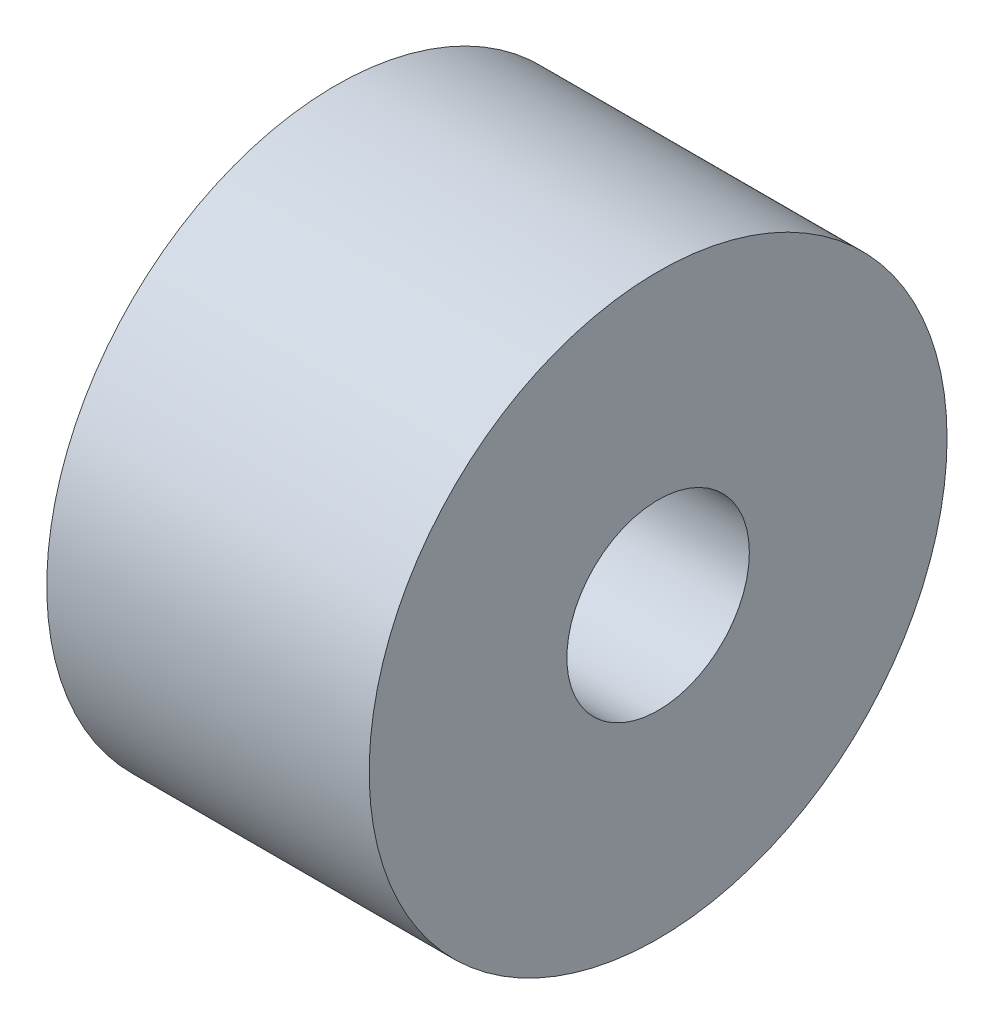
ISO-10303-21;
HEADER;
FILE_DESCRIPTION(('STEP AP214'),'2;1');
FILE_NAME('part.step','',(''),(''),'','','');
FILE_SCHEMA(('AUTOMOTIVE_DESIGN { 1 0 10303 214 1 1 1 1 }'));
ENDSEC;
DATA;
#1=APPLICATION_CONTEXT('core data for automotive mechanical design processes');
#2=APPLICATION_PROTOCOL_DEFINITION('international standard','automotive_design',2000,#1);
#3=PRODUCT_CONTEXT('',#1,'mechanical');
#4=PRODUCT('Part','Part','',(#3));
#5=PRODUCT_RELATED_PRODUCT_CATEGORY('part','',(#4));
#6=PRODUCT_DEFINITION_FORMATION('','',#4);
#7=PRODUCT_DEFINITION_CONTEXT('part definition',#1,'design');
#8=PRODUCT_DEFINITION('design','',#6,#7);
#9=PRODUCT_DEFINITION_SHAPE('','',#8);
#10=(LENGTH_UNIT() NAMED_UNIT(*) SI_UNIT(.MILLI.,.METRE.));
#11=(NAMED_UNIT(*) PLANE_ANGLE_UNIT() SI_UNIT($,.RADIAN.));
#12=(NAMED_UNIT(*) SI_UNIT($,.STERADIAN.) SOLID_ANGLE_UNIT());
#13=UNCERTAINTY_MEASURE_WITH_UNIT(LENGTH_MEASURE(1.E-05),#10,'distance_accuracy_value','');
#14=(GEOMETRIC_REPRESENTATION_CONTEXT(3) GLOBAL_UNCERTAINTY_ASSIGNED_CONTEXT((#13)) GLOBAL_UNIT_ASSIGNED_CONTEXT((#10,
#11,#12)) REPRESENTATION_CONTEXT('',''));
#15=CARTESIAN_POINT('',(0.,0.,0.));
#16=DIRECTION('',(0.,0.,1.));
#17=DIRECTION('',(1.,0.,0.));
#18=AXIS2_PLACEMENT_3D('',#15,#16,#17);
#19=CARTESIAN_POINT('',(0.,9.5,0.));
#20=DIRECTION('',(-1.,0.,0.));
#21=DIRECTION('',(0.,0.,1.));
#22=AXIS2_PLACEMENT_3D('',#19,#20,#21);
#23=PLANE('',#22);
#24=CARTESIAN_POINT('',(0.,0.,0.));
#25=DIRECTION('',(1.,0.,0.));
#26=DIRECTION('',(0.,0.,-1.));
#27=AXIS2_PLACEMENT_3D('',#24,#25,#26);
#28=CIRCLE('',#27,3.);
#29=CARTESIAN_POINT('',(0.,0.,-3.));
#30=VERTEX_POINT('',#29);
#31=EDGE_CURVE('E32',#30,#30,#28,.T.);
#32=ORIENTED_EDGE('',*,*,#31,.T.);
#33=EDGE_LOOP('',(#32));
#34=FACE_BOUND('',#33,.T.);
#35=CARTESIAN_POINT('',(0.,0.,0.));
#36=DIRECTION('',(1.,0.,0.));
#37=DIRECTION('',(0.,0.,-1.));
#38=AXIS2_PLACEMENT_3D('',#35,#36,#37);
#39=CIRCLE('',#38,9.5);
#40=CARTESIAN_POINT('',(0.,0.,-9.5));
#41=VERTEX_POINT('',#40);
#42=EDGE_CURVE('E27',#41,#41,#39,.T.);
#43=ORIENTED_EDGE('',*,*,#42,.F.);
#44=EDGE_LOOP('',(#43));
#45=FACE_BOUND('',#44,.T.);
#46=ADVANCED_FACE('F15',(#34,#45),#23,.T.);
#47=CARTESIAN_POINT('',(10.6,0.,0.));
#48=DIRECTION('',(1.,0.,0.));
#49=DIRECTION('',(0.,0.,-1.));
#50=AXIS2_PLACEMENT_3D('',#47,#48,#49);
#51=CYLINDRICAL_SURFACE('',#50,3.);
#52=CARTESIAN_POINT('',(10.6,0.,0.));
#53=DIRECTION('',(1.,0.,0.));
#54=DIRECTION('',(0.,0.,-1.));
#55=AXIS2_PLACEMENT_3D('',#52,#53,#54);
#56=CIRCLE('',#55,3.);
#57=CARTESIAN_POINT('',(10.6,0.,-3.));
#58=VERTEX_POINT('',#57);
#59=EDGE_CURVE('E22',#58,#58,#56,.T.);
#60=ORIENTED_EDGE('',*,*,#59,.T.);
#61=EDGE_LOOP('',(#60));
#62=FACE_BOUND('',#61,.T.);
#63=ORIENTED_EDGE('',*,*,#31,.F.);
#64=EDGE_LOOP('',(#63));
#65=FACE_BOUND('',#64,.T.);
#66=ADVANCED_FACE('F40',(#62,#65),#51,.F.);
#67=CARTESIAN_POINT('',(10.6,0.,0.));
#68=DIRECTION('',(1.,0.,0.));
#69=DIRECTION('',(0.,0.,-1.));
#70=AXIS2_PLACEMENT_3D('',#67,#68,#69);
#71=CYLINDRICAL_SURFACE('',#70,9.5);
#72=ORIENTED_EDGE('',*,*,#42,.T.);
#73=EDGE_LOOP('',(#72));
#74=FACE_BOUND('',#73,.T.);
#75=CARTESIAN_POINT('',(10.6,0.,0.));
#76=DIRECTION('',(1.,0.,0.));
#77=DIRECTION('',(0.,0.,-1.));
#78=AXIS2_PLACEMENT_3D('',#75,#76,#77);
#79=CIRCLE('',#78,9.5);
#80=CARTESIAN_POINT('',(10.6,0.,-9.5));
#81=VERTEX_POINT('',#80);
#82=EDGE_CURVE('E10',#81,#81,#79,.T.);
#83=ORIENTED_EDGE('',*,*,#82,.F.);
#84=EDGE_LOOP('',(#83));
#85=FACE_BOUND('',#84,.T.);
#86=ADVANCED_FACE('F42',(#74,#85),#71,.T.);
#87=CARTESIAN_POINT('',(10.6,3.,0.));
#88=DIRECTION('',(1.,0.,0.));
#89=DIRECTION('',(0.,0.,-1.));
#90=AXIS2_PLACEMENT_3D('',#87,#88,#89);
#91=PLANE('',#90);
#92=ORIENTED_EDGE('',*,*,#82,.T.);
#93=EDGE_LOOP('',(#92));
#94=FACE_BOUND('',#93,.T.);
#95=ORIENTED_EDGE('',*,*,#59,.F.);
#96=EDGE_LOOP('',(#95));
#97=FACE_BOUND('',#96,.T.);
#98=ADVANCED_FACE('F17',(#94,#97),#91,.T.);
#99=CLOSED_SHELL('',(#46,#66,#86,#98));
#100=MANIFOLD_SOLID_BREP('B1',#99);
#101=ADVANCED_BREP_SHAPE_REPRESENTATION('',(#18,#100),#14);
#102=SHAPE_DEFINITION_REPRESENTATION(#9,#101);
ENDSEC;
END-ISO-10303-21;
